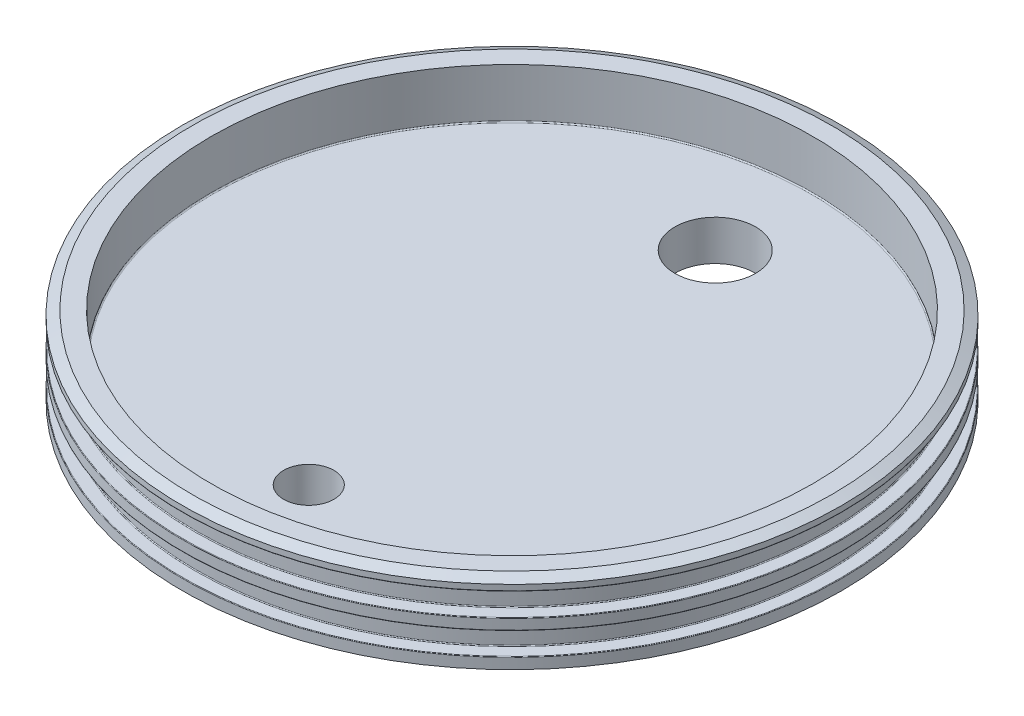
ISO-10303-21;
HEADER;
FILE_DESCRIPTION(('STEP AP214'),'2;1');
FILE_NAME('part.step','',(''),(''),'','','');
FILE_SCHEMA(('AUTOMOTIVE_DESIGN { 1 0 10303 214 1 1 1 1 }'));
ENDSEC;
DATA;
#1=APPLICATION_CONTEXT('core data for automotive mechanical design processes');
#2=APPLICATION_PROTOCOL_DEFINITION('international standard','automotive_design',2000,#1);
#3=PRODUCT_CONTEXT('',#1,'mechanical');
#4=PRODUCT('Part','Part','',(#3));
#5=PRODUCT_RELATED_PRODUCT_CATEGORY('part','',(#4));
#6=PRODUCT_DEFINITION_FORMATION('','',#4);
#7=PRODUCT_DEFINITION_CONTEXT('part definition',#1,'design');
#8=PRODUCT_DEFINITION('design','',#6,#7);
#9=PRODUCT_DEFINITION_SHAPE('','',#8);
#10=(LENGTH_UNIT() NAMED_UNIT(*) SI_UNIT(.MILLI.,.METRE.));
#11=(NAMED_UNIT(*) PLANE_ANGLE_UNIT() SI_UNIT($,.RADIAN.));
#12=(NAMED_UNIT(*) SI_UNIT($,.STERADIAN.) SOLID_ANGLE_UNIT());
#13=UNCERTAINTY_MEASURE_WITH_UNIT(LENGTH_MEASURE(1.E-05),#10,'distance_accuracy_value','');
#14=(GEOMETRIC_REPRESENTATION_CONTEXT(3) GLOBAL_UNCERTAINTY_ASSIGNED_CONTEXT((#13)) GLOBAL_UNIT_ASSIGNED_CONTEXT((#10,
#11,#12)) REPRESENTATION_CONTEXT('',''));
#15=CARTESIAN_POINT('',(0.,0.,0.));
#16=DIRECTION('',(0.,0.,1.));
#17=DIRECTION('',(1.,0.,0.));
#18=AXIS2_PLACEMENT_3D('',#15,#16,#17);
#19=CARTESIAN_POINT('',(0.,0.,0.));
#20=DIRECTION('',(0.,1.,0.));
#21=DIRECTION('',(-1.,0.,0.));
#22=AXIS2_PLACEMENT_3D('',#19,#20,#21);
#23=PLANE('',#22);
#24=CARTESIAN_POINT('',(0.,0.,0.));
#25=DIRECTION('',(0.,1.,0.));
#26=DIRECTION('',(-1.,0.,0.));
#27=AXIS2_PLACEMENT_3D('',#24,#25,#26);
#28=CIRCLE('',#27,66.2178);
#29=CARTESIAN_POINT('',(-66.2178,0.,0.));
#30=VERTEX_POINT('',#29);
#31=EDGE_CURVE('E113',#30,#30,#28,.T.);
#32=ORIENTED_EDGE('',*,*,#31,.T.);
#33=EDGE_LOOP('',(#32));
#34=FACE_BOUND('',#33,.T.);
#35=CARTESIAN_POINT('',(0.,0.,0.));
#36=DIRECTION('',(0.,1.,0.));
#37=DIRECTION('',(-1.,0.,0.));
#38=AXIS2_PLACEMENT_3D('',#35,#36,#37);
#39=CIRCLE('',#38,72.898);
#40=CARTESIAN_POINT('',(-72.898,0.,0.));
#41=VERTEX_POINT('',#40);
#42=EDGE_CURVE('E119',#41,#41,#39,.T.);
#43=ORIENTED_EDGE('',*,*,#42,.F.);
#44=EDGE_LOOP('',(#43));
#45=FACE_BOUND('',#44,.T.);
#46=ADVANCED_FACE('F39',(#34,#45),#23,.F.);
#47=CARTESIAN_POINT('',(0.,48.1922132313012,0.));
#48=DIRECTION('',(0.,1.,0.));
#49=DIRECTION('',(-1.,0.,0.));
#50=AXIS2_PLACEMENT_3D('',#47,#48,#49);
#51=CYLINDRICAL_SURFACE('',#50,72.898);
#52=CARTESIAN_POINT('',(0.,2.33679999999999,0.));
#53=DIRECTION('',(0.,-1.,0.));
#54=DIRECTION('',(1.,0.,0.));
#55=AXIS2_PLACEMENT_3D('',#52,#53,#54);
#56=CIRCLE('',#55,72.898);
#57=CARTESIAN_POINT('',(72.898,2.3368,0.));
#58=VERTEX_POINT('',#57);
#59=EDGE_CURVE('E59',#58,#58,#56,.T.);
#60=ORIENTED_EDGE('',*,*,#59,.T.);
#61=EDGE_LOOP('',(#60));
#62=FACE_BOUND('',#61,.T.);
#63=ORIENTED_EDGE('',*,*,#42,.T.);
#64=EDGE_LOOP('',(#63));
#65=FACE_BOUND('',#64,.T.);
#66=ADVANCED_FACE('F166',(#62,#65),#51,.T.);
#67=CARTESIAN_POINT('',(72.898,2.4638,0.));
#68=DIRECTION('',(0.,-1.,0.));
#69=DIRECTION('',(1.,0.,0.));
#70=AXIS2_PLACEMENT_3D('',#67,#68,#69);
#71=PLANE('',#70);
#72=CARTESIAN_POINT('',(0.,2.46379999999999,0.));
#73=DIRECTION('',(0.,-1.,0.));
#74=DIRECTION('',(1.,0.,0.));
#75=AXIS2_PLACEMENT_3D('',#72,#73,#74);
#76=CIRCLE('',#75,72.771);
#77=CARTESIAN_POINT('',(72.771,2.4638,0.));
#78=VERTEX_POINT('',#77);
#79=EDGE_CURVE('E62',#78,#78,#76,.F.);
#80=ORIENTED_EDGE('',*,*,#79,.T.);
#81=EDGE_LOOP('',(#80));
#82=FACE_BOUND('',#81,.T.);
#83=CARTESIAN_POINT('',(0.,2.46379999999999,0.));
#84=DIRECTION('',(0.,-1.,0.));
#85=DIRECTION('',(1.,0.,0.));
#86=AXIS2_PLACEMENT_3D('',#83,#84,#85);
#87=CIRCLE('',#86,70.1548);
#88=CARTESIAN_POINT('',(70.1548,2.4638,0.));
#89=VERTEX_POINT('',#88);
#90=EDGE_CURVE('E89',#89,#89,#87,.T.);
#91=ORIENTED_EDGE('',*,*,#90,.T.);
#92=EDGE_LOOP('',(#91));
#93=FACE_BOUND('',#92,.T.);
#94=ADVANCED_FACE('F173',(#82,#93),#71,.F.);
#95=CARTESIAN_POINT('',(0.,48.1922132313012,0.));
#96=DIRECTION('',(0.,1.,0.));
#97=DIRECTION('',(-1.,0.,0.));
#98=AXIS2_PLACEMENT_3D('',#95,#96,#97);
#99=CYLINDRICAL_SURFACE('',#98,69.977);
#100=CARTESIAN_POINT('',(0.,7.26439999999999,0.));
#101=DIRECTION('',(0.,1.,0.));
#102=DIRECTION('',(-1.,0.,0.));
#103=AXIS2_PLACEMENT_3D('',#100,#101,#102);
#104=CIRCLE('',#103,69.977);
#105=CARTESIAN_POINT('',(-69.977,7.26439999999998,0.));
#106=VERTEX_POINT('',#105);
#107=EDGE_CURVE('E92',#106,#106,#104,.F.);
#108=ORIENTED_EDGE('',*,*,#107,.T.);
#109=EDGE_LOOP('',(#108));
#110=FACE_BOUND('',#109,.T.);
#111=CARTESIAN_POINT('',(0.,2.64159999999999,0.));
#112=DIRECTION('',(0.,-1.,0.));
#113=DIRECTION('',(1.,0.,0.));
#114=AXIS2_PLACEMENT_3D('',#111,#112,#113);
#115=CIRCLE('',#114,69.977);
#116=CARTESIAN_POINT('',(69.977,2.6416,0.));
#117=VERTEX_POINT('',#116);
#118=EDGE_CURVE('E95',#117,#117,#115,.F.);
#119=ORIENTED_EDGE('',*,*,#118,.T.);
#120=EDGE_LOOP('',(#119));
#121=FACE_BOUND('',#120,.T.);
#122=ADVANCED_FACE('F235',(#110,#121),#99,.T.);
#123=CARTESIAN_POINT('',(69.977,7.4422,0.));
#124=DIRECTION('',(0.,1.,0.));
#125=DIRECTION('',(-1.,0.,0.));
#126=AXIS2_PLACEMENT_3D('',#123,#124,#125);
#127=PLANE('',#126);
#128=CARTESIAN_POINT('',(0.,7.44219999999999,0.));
#129=DIRECTION('',(0.,1.,0.));
#130=DIRECTION('',(-1.,0.,0.));
#131=AXIS2_PLACEMENT_3D('',#128,#129,#130);
#132=CIRCLE('',#131,72.771);
#133=CARTESIAN_POINT('',(-72.771,7.44219999999998,0.));
#134=VERTEX_POINT('',#133);
#135=EDGE_CURVE('E65',#134,#134,#132,.F.);
#136=ORIENTED_EDGE('',*,*,#135,.T.);
#137=EDGE_LOOP('',(#136));
#138=FACE_BOUND('',#137,.T.);
#139=CARTESIAN_POINT('',(0.,7.44219999999999,0.));
#140=DIRECTION('',(0.,1.,0.));
#141=DIRECTION('',(-1.,0.,0.));
#142=AXIS2_PLACEMENT_3D('',#139,#140,#141);
#143=CIRCLE('',#142,70.1548);
#144=CARTESIAN_POINT('',(-70.1548,7.44219999999998,0.));
#145=VERTEX_POINT('',#144);
#146=EDGE_CURVE('E98',#145,#145,#143,.T.);
#147=ORIENTED_EDGE('',*,*,#146,.T.);
#148=EDGE_LOOP('',(#147));
#149=FACE_BOUND('',#148,.T.);
#150=ADVANCED_FACE('F231',(#138,#149),#127,.F.);
#151=CARTESIAN_POINT('',(0.,48.1922132313012,0.));
#152=DIRECTION('',(0.,1.,0.));
#153=DIRECTION('',(-1.,0.,0.));
#154=AXIS2_PLACEMENT_3D('',#151,#152,#153);
#155=CYLINDRICAL_SURFACE('',#154,72.898);
#156=CARTESIAN_POINT('',(0.,9.77899999999999,0.));
#157=DIRECTION('',(0.,-1.,0.));
#158=DIRECTION('',(1.,0.,0.));
#159=AXIS2_PLACEMENT_3D('',#156,#157,#158);
#160=CIRCLE('',#159,72.898);
#161=CARTESIAN_POINT('',(72.898,9.779,0.));
#162=VERTEX_POINT('',#161);
#163=EDGE_CURVE('E80',#162,#162,#160,.T.);
#164=ORIENTED_EDGE('',*,*,#163,.T.);
#165=EDGE_LOOP('',(#164));
#166=FACE_BOUND('',#165,.T.);
#167=CARTESIAN_POINT('',(0.,7.56919999999999,0.));
#168=DIRECTION('',(0.,1.,0.));
#169=DIRECTION('',(-1.,0.,0.));
#170=AXIS2_PLACEMENT_3D('',#167,#168,#169);
#171=CIRCLE('',#170,72.898);
#172=CARTESIAN_POINT('',(-72.898,7.56919999999998,0.));
#173=VERTEX_POINT('',#172);
#174=EDGE_CURVE('E83',#173,#173,#171,.T.);
#175=ORIENTED_EDGE('',*,*,#174,.T.);
#176=EDGE_LOOP('',(#175));
#177=FACE_BOUND('',#176,.T.);
#178=ADVANCED_FACE('F211',(#166,#177),#155,.T.);
#179=CARTESIAN_POINT('',(72.898,9.906,0.));
#180=DIRECTION('',(0.,-1.,0.));
#181=DIRECTION('',(1.,0.,0.));
#182=AXIS2_PLACEMENT_3D('',#179,#180,#181);
#183=PLANE('',#182);
#184=CARTESIAN_POINT('',(0.,9.90599999999999,0.));
#185=DIRECTION('',(0.,-1.,0.));
#186=DIRECTION('',(1.,0.,0.));
#187=AXIS2_PLACEMENT_3D('',#184,#185,#186);
#188=CIRCLE('',#187,72.771);
#189=CARTESIAN_POINT('',(72.771,9.906,0.));
#190=VERTEX_POINT('',#189);
#191=EDGE_CURVE('E86',#190,#190,#188,.F.);
#192=ORIENTED_EDGE('',*,*,#191,.T.);
#193=EDGE_LOOP('',(#192));
#194=FACE_BOUND('',#193,.T.);
#195=CARTESIAN_POINT('',(0.,9.90599999999999,0.));
#196=DIRECTION('',(0.,-1.,0.));
#197=DIRECTION('',(1.,0.,0.));
#198=AXIS2_PLACEMENT_3D('',#195,#196,#197);
#199=CIRCLE('',#198,70.1548);
#200=CARTESIAN_POINT('',(70.1548,9.906,0.));
#201=VERTEX_POINT('',#200);
#202=EDGE_CURVE('E101',#201,#201,#199,.T.);
#203=ORIENTED_EDGE('',*,*,#202,.T.);
#204=EDGE_LOOP('',(#203));
#205=FACE_BOUND('',#204,.T.);
#206=ADVANCED_FACE('F207',(#194,#205),#183,.F.);
#207=CARTESIAN_POINT('',(0.,48.1922132313012,0.));
#208=DIRECTION('',(0.,1.,0.));
#209=DIRECTION('',(-1.,0.,0.));
#210=AXIS2_PLACEMENT_3D('',#207,#208,#209);
#211=CYLINDRICAL_SURFACE('',#210,69.977);
#212=CARTESIAN_POINT('',(0.,14.8082,0.));
#213=DIRECTION('',(0.,1.,0.));
#214=DIRECTION('',(-1.,0.,0.));
#215=AXIS2_PLACEMENT_3D('',#212,#213,#214);
#216=CIRCLE('',#215,69.977);
#217=CARTESIAN_POINT('',(-69.977,14.8082,0.));
#218=VERTEX_POINT('',#217);
#219=EDGE_CURVE('E104',#218,#218,#216,.F.);
#220=ORIENTED_EDGE('',*,*,#219,.T.);
#221=EDGE_LOOP('',(#220));
#222=FACE_BOUND('',#221,.T.);
#223=CARTESIAN_POINT('',(0.,10.0838,0.));
#224=DIRECTION('',(0.,-1.,0.));
#225=DIRECTION('',(1.,0.,0.));
#226=AXIS2_PLACEMENT_3D('',#223,#224,#225);
#227=CIRCLE('',#226,69.977);
#228=CARTESIAN_POINT('',(69.977,10.0838,0.));
#229=VERTEX_POINT('',#228);
#230=EDGE_CURVE('E107',#229,#229,#227,.F.);
#231=ORIENTED_EDGE('',*,*,#230,.T.);
#232=EDGE_LOOP('',(#231));
#233=FACE_BOUND('',#232,.T.);
#234=ADVANCED_FACE('F210',(#222,#233),#211,.T.);
#235=CARTESIAN_POINT('',(69.977,14.986,0.));
#236=DIRECTION('',(0.,1.,0.));
#237=DIRECTION('',(-1.,0.,0.));
#238=AXIS2_PLACEMENT_3D('',#235,#236,#237);
#239=PLANE('',#238);
#240=CARTESIAN_POINT('',(0.,14.986,0.));
#241=DIRECTION('',(0.,1.,0.));
#242=DIRECTION('',(-1.,0.,0.));
#243=AXIS2_PLACEMENT_3D('',#240,#241,#242);
#244=CIRCLE('',#243,72.771);
#245=CARTESIAN_POINT('',(-72.771,14.986,0.));
#246=VERTEX_POINT('',#245);
#247=EDGE_CURVE('E74',#246,#246,#244,.F.);
#248=ORIENTED_EDGE('',*,*,#247,.T.);
#249=EDGE_LOOP('',(#248));
#250=FACE_BOUND('',#249,.T.);
#251=CARTESIAN_POINT('',(0.,14.986,0.));
#252=DIRECTION('',(0.,1.,0.));
#253=DIRECTION('',(-1.,0.,0.));
#254=AXIS2_PLACEMENT_3D('',#251,#252,#253);
#255=CIRCLE('',#254,70.1548);
#256=CARTESIAN_POINT('',(-70.1548,14.986,0.));
#257=VERTEX_POINT('',#256);
#258=EDGE_CURVE('E110',#257,#257,#255,.T.);
#259=ORIENTED_EDGE('',*,*,#258,.T.);
#260=EDGE_LOOP('',(#259));
#261=FACE_BOUND('',#260,.T.);
#262=ADVANCED_FACE('F218',(#250,#261),#239,.F.);
#263=CARTESIAN_POINT('',(0.,48.1922132313012,0.));
#264=DIRECTION('',(0.,1.,0.));
#265=DIRECTION('',(-1.,0.,0.));
#266=AXIS2_PLACEMENT_3D('',#263,#264,#265);
#267=CYLINDRICAL_SURFACE('',#266,72.898);
#268=CARTESIAN_POINT('',(0.,16.3322,0.));
#269=DIRECTION('',(0.,-1.,0.));
#270=DIRECTION('',(1.,0.,0.));
#271=AXIS2_PLACEMENT_3D('',#268,#269,#270);
#272=CIRCLE('',#271,72.898);
#273=CARTESIAN_POINT('',(72.898,16.3322,0.));
#274=VERTEX_POINT('',#273);
#275=EDGE_CURVE('E51',#274,#274,#272,.T.);
#276=ORIENTED_EDGE('',*,*,#275,.T.);
#277=EDGE_LOOP('',(#276));
#278=FACE_BOUND('',#277,.T.);
#279=CARTESIAN_POINT('',(0.,15.113,0.));
#280=DIRECTION('',(0.,1.,0.));
#281=DIRECTION('',(-1.,0.,0.));
#282=AXIS2_PLACEMENT_3D('',#279,#280,#281);
#283=CIRCLE('',#282,72.898);
#284=CARTESIAN_POINT('',(-72.898,15.113,0.));
#285=VERTEX_POINT('',#284);
#286=EDGE_CURVE('E77',#285,#285,#283,.T.);
#287=ORIENTED_EDGE('',*,*,#286,.T.);
#288=EDGE_LOOP('',(#287));
#289=FACE_BOUND('',#288,.T.);
#290=ADVANCED_FACE('F224',(#278,#289),#267,.T.);
#291=CARTESIAN_POINT('',(72.898,17.3482,0.));
#292=DIRECTION('',(0.,-1.,0.));
#293=DIRECTION('',(1.,0.,0.));
#294=AXIS2_PLACEMENT_3D('',#291,#292,#293);
#295=PLANE('',#294);
#296=CARTESIAN_POINT('',(0.,17.3482,0.));
#297=DIRECTION('',(0.,-1.,0.));
#298=DIRECTION('',(1.,0.,0.));
#299=AXIS2_PLACEMENT_3D('',#296,#297,#298);
#300=CIRCLE('',#299,70.7191809687623);
#301=CARTESIAN_POINT('',(70.7191809687623,17.3482,0.));
#302=VERTEX_POINT('',#301);
#303=EDGE_CURVE('E56',#302,#302,#300,.F.);
#304=ORIENTED_EDGE('',*,*,#303,.T.);
#305=EDGE_LOOP('',(#304));
#306=FACE_BOUND('',#305,.T.);
#307=CARTESIAN_POINT('',(0.,17.3482,0.));
#308=DIRECTION('',(0.,1.,0.));
#309=DIRECTION('',(-1.,0.,0.));
#310=AXIS2_PLACEMENT_3D('',#307,#308,#309);
#311=CIRCLE('',#310,66.548);
#312=CARTESIAN_POINT('',(-66.548,17.3482,0.));
#313=VERTEX_POINT('',#312);
#314=EDGE_CURVE('E122',#313,#313,#311,.T.);
#315=ORIENTED_EDGE('',*,*,#314,.F.);
#316=EDGE_LOOP('',(#315));
#317=FACE_BOUND('',#316,.T.);
#318=ADVANCED_FACE('F275',(#306,#317),#295,.F.);
#319=CARTESIAN_POINT('',(0.,48.1922132313012,0.));
#320=DIRECTION('',(0.,1.,0.));
#321=DIRECTION('',(-1.,0.,0.));
#322=AXIS2_PLACEMENT_3D('',#319,#320,#321);
#323=CYLINDRICAL_SURFACE('',#322,66.548);
#324=CARTESIAN_POINT('',(0.,6.604,0.));
#325=DIRECTION('',(0.,-1.,0.));
#326=DIRECTION('',(1.,0.,0.));
#327=AXIS2_PLACEMENT_3D('',#324,#325,#326);
#328=CIRCLE('',#327,66.548);
#329=CARTESIAN_POINT('',(66.548,6.60400000000001,0.));
#330=VERTEX_POINT('',#329);
#331=EDGE_CURVE('E10',#330,#330,#328,.T.);
#332=ORIENTED_EDGE('',*,*,#331,.T.);
#333=EDGE_LOOP('',(#332));
#334=FACE_BOUND('',#333,.T.);
#335=ORIENTED_EDGE('',*,*,#314,.T.);
#336=EDGE_LOOP('',(#335));
#337=FACE_BOUND('',#336,.T.);
#338=ADVANCED_FACE('F277',(#334,#337),#323,.F.);
#339=CARTESIAN_POINT('',(66.548,6.35,0.));
#340=DIRECTION('',(0.,-1.,0.));
#341=DIRECTION('',(1.,0.,0.));
#342=AXIS2_PLACEMENT_3D('',#339,#340,#341);
#343=PLANE('',#342);
#344=CARTESIAN_POINT('',(0.,6.34999999999999,44.958));
#345=DIRECTION('',(0.,-1.,0.));
#346=DIRECTION('',(1.,0.,0.));
#347=AXIS2_PLACEMENT_3D('',#344,#345,#346);
#348=CIRCLE('',#347,5.56259999999999);
#349=CARTESIAN_POINT('',(5.56259999999999,6.35,44.958));
#350=VERTEX_POINT('',#349);
#351=EDGE_CURVE('E128',#350,#350,#348,.T.);
#352=ORIENTED_EDGE('',*,*,#351,.T.);
#353=EDGE_LOOP('',(#352));
#354=FACE_BOUND('',#353,.T.);
#355=CARTESIAN_POINT('',(0.,6.34999999999999,-44.958));
#356=DIRECTION('',(0.,-1.,0.));
#357=DIRECTION('',(1.,0.,0.));
#358=AXIS2_PLACEMENT_3D('',#355,#356,#357);
#359=CIRCLE('',#358,8.9281);
#360=CARTESIAN_POINT('',(8.9281,6.35,-44.958));
#361=VERTEX_POINT('',#360);
#362=EDGE_CURVE('E43',#361,#361,#359,.T.);
#363=ORIENTED_EDGE('',*,*,#362,.T.);
#364=EDGE_LOOP('',(#363));
#365=FACE_BOUND('',#364,.T.);
#366=CARTESIAN_POINT('',(0.,6.35,0.));
#367=DIRECTION('',(0.,-1.,0.));
#368=DIRECTION('',(1.,0.,0.));
#369=AXIS2_PLACEMENT_3D('',#366,#367,#368);
#370=CIRCLE('',#369,66.294);
#371=CARTESIAN_POINT('',(66.294,6.35,0.));
#372=VERTEX_POINT('',#371);
#373=EDGE_CURVE('E47',#372,#372,#370,.F.);
#374=ORIENTED_EDGE('',*,*,#373,.T.);
#375=EDGE_LOOP('',(#374));
#376=FACE_BOUND('',#375,.T.);
#377=ADVANCED_FACE('F281',(#354,#365,#376),#343,.F.);
#378=CARTESIAN_POINT('',(0.,-2.54,0.));
#379=DIRECTION('',(0.,1.,0.));
#380=DIRECTION('',(-1.,0.,0.));
#381=AXIS2_PLACEMENT_3D('',#378,#379,#380);
#382=CYLINDRICAL_SURFACE('',#381,66.04);
#383=CARTESIAN_POINT('',(0.,-2.413,0.));
#384=DIRECTION('',(0.,-1.,0.));
#385=DIRECTION('',(1.,0.,0.));
#386=AXIS2_PLACEMENT_3D('',#383,#384,#385);
#387=CIRCLE('',#386,66.04);
#388=CARTESIAN_POINT('',(66.04,-2.41299999999999,0.));
#389=VERTEX_POINT('',#388);
#390=EDGE_CURVE('E68',#389,#389,#387,.F.);
#391=ORIENTED_EDGE('',*,*,#390,.T.);
#392=EDGE_LOOP('',(#391));
#393=FACE_BOUND('',#392,.T.);
#394=CARTESIAN_POINT('',(0.,-0.177800000000004,0.));
#395=DIRECTION('',(0.,1.,0.));
#396=DIRECTION('',(-1.,0.,0.));
#397=AXIS2_PLACEMENT_3D('',#394,#395,#396);
#398=CIRCLE('',#397,66.04);
#399=CARTESIAN_POINT('',(-66.04,-0.177800000000012,0.));
#400=VERTEX_POINT('',#399);
#401=EDGE_CURVE('E116',#400,#400,#398,.F.);
#402=ORIENTED_EDGE('',*,*,#401,.T.);
#403=EDGE_LOOP('',(#402));
#404=FACE_BOUND('',#403,.T.);
#405=ADVANCED_FACE('F142',(#393,#404),#382,.T.);
#406=CARTESIAN_POINT('',(0.,-2.54,0.));
#407=DIRECTION('',(0.,-1.,0.));
#408=DIRECTION('',(1.,0.,0.));
#409=AXIS2_PLACEMENT_3D('',#406,#407,#408);
#410=PLANE('',#409);
#411=CARTESIAN_POINT('',(0.,-2.54,44.958));
#412=DIRECTION('',(0.,-1.,0.));
#413=DIRECTION('',(0.,0.,-1.));
#414=AXIS2_PLACEMENT_3D('',#411,#412,#413);
#415=CIRCLE('',#414,5.56259999999999);
#416=CARTESIAN_POINT('',(0.,-2.54,39.3954));
#417=VERTEX_POINT('',#416);
#418=EDGE_CURVE('E131',#417,#417,#415,.T.);
#419=ORIENTED_EDGE('',*,*,#418,.F.);
#420=EDGE_LOOP('',(#419));
#421=FACE_BOUND('',#420,.T.);
#422=CARTESIAN_POINT('',(0.,-2.54,-44.958));
#423=DIRECTION('',(0.,-1.,0.));
#424=DIRECTION('',(0.,0.,-1.));
#425=AXIS2_PLACEMENT_3D('',#422,#423,#424);
#426=CIRCLE('',#425,8.9281);
#427=CARTESIAN_POINT('',(0.,-2.54,-53.8861));
#428=VERTEX_POINT('',#427);
#429=EDGE_CURVE('E125',#428,#428,#426,.T.);
#430=ORIENTED_EDGE('',*,*,#429,.F.);
#431=EDGE_LOOP('',(#430));
#432=FACE_BOUND('',#431,.T.);
#433=CARTESIAN_POINT('',(0.,-2.54,0.));
#434=DIRECTION('',(0.,-1.,0.));
#435=DIRECTION('',(1.,0.,0.));
#436=AXIS2_PLACEMENT_3D('',#433,#434,#435);
#437=CIRCLE('',#436,65.913);
#438=CARTESIAN_POINT('',(65.913,-2.53999999999999,0.));
#439=VERTEX_POINT('',#438);
#440=EDGE_CURVE('E71',#439,#439,#437,.T.);
#441=ORIENTED_EDGE('',*,*,#440,.T.);
#442=EDGE_LOOP('',(#441));
#443=FACE_BOUND('',#442,.T.);
#444=ADVANCED_FACE('F138',(#421,#432,#443),#410,.T.);
#445=CARTESIAN_POINT('',(0.,-0.177800000000004,0.));
#446=DIRECTION('',(0.,1.,0.));
#447=DIRECTION('',(-1.,0.,0.));
#448=AXIS2_PLACEMENT_3D('',#445,#446,#447);
#449=TOROIDAL_SURFACE('',#448,66.2178,0.1778);
#450=ORIENTED_EDGE('',*,*,#31,.F.);
#451=EDGE_LOOP('',(#450));
#452=FACE_BOUND('',#451,.T.);
#453=ORIENTED_EDGE('',*,*,#401,.F.);
#454=EDGE_LOOP('',(#453));
#455=FACE_BOUND('',#454,.T.);
#456=ADVANCED_FACE('F141',(#452,#455),#449,.F.);
#457=CARTESIAN_POINT('',(0.,14.8082,0.));
#458=DIRECTION('',(0.,1.,0.));
#459=DIRECTION('',(-1.,0.,0.));
#460=AXIS2_PLACEMENT_3D('',#457,#458,#459);
#461=TOROIDAL_SURFACE('',#460,70.1548,0.1778);
#462=ORIENTED_EDGE('',*,*,#219,.F.);
#463=EDGE_LOOP('',(#462));
#464=FACE_BOUND('',#463,.T.);
#465=ORIENTED_EDGE('',*,*,#258,.F.);
#466=EDGE_LOOP('',(#465));
#467=FACE_BOUND('',#466,.T.);
#468=ADVANCED_FACE('F181',(#464,#467),#461,.F.);
#469=CARTESIAN_POINT('',(0.,10.0838,0.));
#470=DIRECTION('',(0.,-1.,0.));
#471=DIRECTION('',(1.,0.,0.));
#472=AXIS2_PLACEMENT_3D('',#469,#470,#471);
#473=TOROIDAL_SURFACE('',#472,70.1548,0.1778);
#474=ORIENTED_EDGE('',*,*,#202,.F.);
#475=EDGE_LOOP('',(#474));
#476=FACE_BOUND('',#475,.T.);
#477=ORIENTED_EDGE('',*,*,#230,.F.);
#478=EDGE_LOOP('',(#477));
#479=FACE_BOUND('',#478,.T.);
#480=ADVANCED_FACE('F185',(#476,#479),#473,.F.);
#481=CARTESIAN_POINT('',(0.,7.26439999999999,0.));
#482=DIRECTION('',(0.,1.,0.));
#483=DIRECTION('',(-1.,0.,0.));
#484=AXIS2_PLACEMENT_3D('',#481,#482,#483);
#485=TOROIDAL_SURFACE('',#484,70.1548,0.1778);
#486=ORIENTED_EDGE('',*,*,#107,.F.);
#487=EDGE_LOOP('',(#486));
#488=FACE_BOUND('',#487,.T.);
#489=ORIENTED_EDGE('',*,*,#146,.F.);
#490=EDGE_LOOP('',(#489));
#491=FACE_BOUND('',#490,.T.);
#492=ADVANCED_FACE('F189',(#488,#491),#485,.F.);
#493=CARTESIAN_POINT('',(0.,2.64159999999999,0.));
#494=DIRECTION('',(0.,-1.,0.));
#495=DIRECTION('',(1.,0.,0.));
#496=AXIS2_PLACEMENT_3D('',#493,#494,#495);
#497=TOROIDAL_SURFACE('',#496,70.1548,0.1778);
#498=ORIENTED_EDGE('',*,*,#90,.F.);
#499=EDGE_LOOP('',(#498));
#500=FACE_BOUND('',#499,.T.);
#501=ORIENTED_EDGE('',*,*,#118,.F.);
#502=EDGE_LOOP('',(#501));
#503=FACE_BOUND('',#502,.T.);
#504=ADVANCED_FACE('F193',(#500,#503),#497,.F.);
#505=CARTESIAN_POINT('',(0.,9.77899999999999,0.));
#506=DIRECTION('',(0.,-1.,0.));
#507=DIRECTION('',(1.,0.,0.));
#508=AXIS2_PLACEMENT_3D('',#505,#506,#507);
#509=TOROIDAL_SURFACE('',#508,72.771,0.127);
#510=ORIENTED_EDGE('',*,*,#163,.F.);
#511=EDGE_LOOP('',(#510));
#512=FACE_BOUND('',#511,.T.);
#513=ORIENTED_EDGE('',*,*,#191,.F.);
#514=EDGE_LOOP('',(#513));
#515=FACE_BOUND('',#514,.T.);
#516=ADVANCED_FACE('F161',(#512,#515),#509,.T.);
#517=CARTESIAN_POINT('',(0.,15.113,0.));
#518=DIRECTION('',(0.,1.,0.));
#519=DIRECTION('',(-1.,0.,0.));
#520=AXIS2_PLACEMENT_3D('',#517,#518,#519);
#521=TOROIDAL_SURFACE('',#520,72.771,0.127);
#522=ORIENTED_EDGE('',*,*,#247,.F.);
#523=EDGE_LOOP('',(#522));
#524=FACE_BOUND('',#523,.T.);
#525=ORIENTED_EDGE('',*,*,#286,.F.);
#526=EDGE_LOOP('',(#525));
#527=FACE_BOUND('',#526,.T.);
#528=ADVANCED_FACE('F151',(#524,#527),#521,.T.);
#529=CARTESIAN_POINT('',(0.,-2.413,0.));
#530=DIRECTION('',(0.,-1.,0.));
#531=DIRECTION('',(1.,0.,0.));
#532=AXIS2_PLACEMENT_3D('',#529,#530,#531);
#533=TOROIDAL_SURFACE('',#532,65.913,0.127);
#534=ORIENTED_EDGE('',*,*,#390,.F.);
#535=EDGE_LOOP('',(#534));
#536=FACE_BOUND('',#535,.T.);
#537=ORIENTED_EDGE('',*,*,#440,.F.);
#538=EDGE_LOOP('',(#537));
#539=FACE_BOUND('',#538,.T.);
#540=ADVANCED_FACE('F148',(#536,#539),#533,.T.);
#541=CARTESIAN_POINT('',(0.,7.56919999999999,0.));
#542=DIRECTION('',(0.,1.,0.));
#543=DIRECTION('',(-1.,0.,0.));
#544=AXIS2_PLACEMENT_3D('',#541,#542,#543);
#545=TOROIDAL_SURFACE('',#544,72.771,0.127);
#546=ORIENTED_EDGE('',*,*,#135,.F.);
#547=EDGE_LOOP('',(#546));
#548=FACE_BOUND('',#547,.T.);
#549=ORIENTED_EDGE('',*,*,#174,.F.);
#550=EDGE_LOOP('',(#549));
#551=FACE_BOUND('',#550,.T.);
#552=ADVANCED_FACE('F150',(#548,#551),#545,.T.);
#553=CARTESIAN_POINT('',(0.,2.33679999999999,0.));
#554=DIRECTION('',(0.,-1.,0.));
#555=DIRECTION('',(1.,0.,0.));
#556=AXIS2_PLACEMENT_3D('',#553,#554,#555);
#557=TOROIDAL_SURFACE('',#556,72.771,0.127);
#558=ORIENTED_EDGE('',*,*,#59,.F.);
#559=EDGE_LOOP('',(#558));
#560=FACE_BOUND('',#559,.T.);
#561=ORIENTED_EDGE('',*,*,#79,.F.);
#562=EDGE_LOOP('',(#561));
#563=FACE_BOUND('',#562,.T.);
#564=ADVANCED_FACE('F158',(#560,#563),#557,.T.);
#565=CARTESIAN_POINT('',(0.,17.3482,0.));
#566=DIRECTION('',(0.,-1.,0.));
#567=DIRECTION('',(1.,0.,0.));
#568=AXIS2_PLACEMENT_3D('',#565,#566,#567);
#569=CONICAL_SURFACE('',#568,70.7191809687623,1.13446401379632);
#570=ORIENTED_EDGE('',*,*,#275,.F.);
#571=EDGE_LOOP('',(#570));
#572=FACE_BOUND('',#571,.T.);
#573=ORIENTED_EDGE('',*,*,#303,.F.);
#574=EDGE_LOOP('',(#573));
#575=FACE_BOUND('',#574,.T.);
#576=ADVANCED_FACE('F250',(#572,#575),#569,.T.);
#577=CARTESIAN_POINT('',(0.,6.604,0.));
#578=DIRECTION('',(0.,-1.,0.));
#579=DIRECTION('',(1.,0.,0.));
#580=AXIS2_PLACEMENT_3D('',#577,#578,#579);
#581=TOROIDAL_SURFACE('',#580,66.294,0.254);
#582=ORIENTED_EDGE('',*,*,#331,.F.);
#583=EDGE_LOOP('',(#582));
#584=FACE_BOUND('',#583,.T.);
#585=ORIENTED_EDGE('',*,*,#373,.F.);
#586=EDGE_LOOP('',(#585));
#587=FACE_BOUND('',#586,.T.);
#588=ADVANCED_FACE('F41',(#584,#587),#581,.F.);
#589=CARTESIAN_POINT('',(0.,-2.54,-44.958));
#590=DIRECTION('',(0.,-1.,0.));
#591=DIRECTION('',(0.,0.,-1.));
#592=AXIS2_PLACEMENT_3D('',#589,#590,#591);
#593=CYLINDRICAL_SURFACE('',#592,8.9281);
#594=ORIENTED_EDGE('',*,*,#429,.T.);
#595=EDGE_LOOP('',(#594));
#596=FACE_BOUND('',#595,.T.);
#597=ORIENTED_EDGE('',*,*,#362,.F.);
#598=EDGE_LOOP('',(#597));
#599=FACE_BOUND('',#598,.T.);
#600=ADVANCED_FACE('F269',(#596,#599),#593,.F.);
#601=CARTESIAN_POINT('',(0.,-2.54,44.958));
#602=DIRECTION('',(0.,-1.,0.));
#603=DIRECTION('',(0.,0.,-1.));
#604=AXIS2_PLACEMENT_3D('',#601,#602,#603);
#605=CYLINDRICAL_SURFACE('',#604,5.56259999999999);
#606=ORIENTED_EDGE('',*,*,#418,.T.);
#607=EDGE_LOOP('',(#606));
#608=FACE_BOUND('',#607,.T.);
#609=ORIENTED_EDGE('',*,*,#351,.F.);
#610=EDGE_LOOP('',(#609));
#611=FACE_BOUND('',#610,.T.);
#612=ADVANCED_FACE('F135',(#608,#611),#605,.F.);
#613=CLOSED_SHELL('',(#46,#66,#94,#122,#150,#178,#206,#234,#262,#290,#318,#338,#377,#405,#444,
#456,#468,#480,#492,#504,#516,#528,#540,#552,#564,#576,#588,#600,#612));
#614=MANIFOLD_SOLID_BREP('B2',#613);
#615=ADVANCED_BREP_SHAPE_REPRESENTATION('',(#18,#614),#14);
#616=SHAPE_DEFINITION_REPRESENTATION(#9,#615);
ENDSEC;
END-ISO-10303-21;
